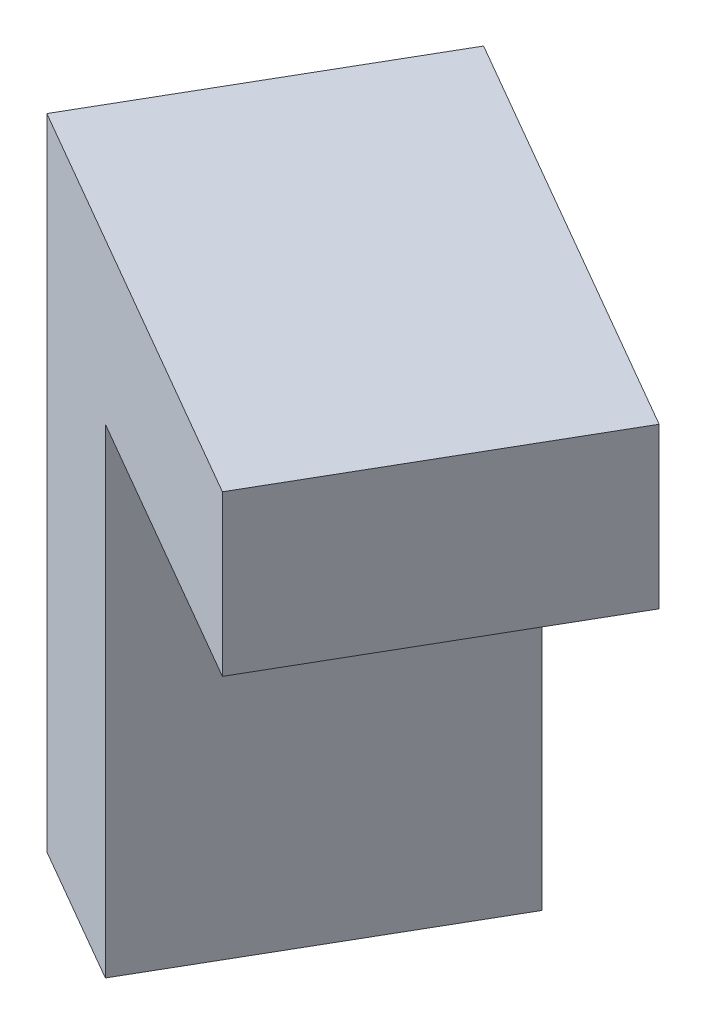
ISO-10303-21;
HEADER;
FILE_DESCRIPTION(('STEP AP214'),'2;1');
FILE_NAME('part.step','',(''),(''),'','','');
FILE_SCHEMA(('AUTOMOTIVE_DESIGN { 1 0 10303 214 1 1 1 1 }'));
ENDSEC;
DATA;
#1=APPLICATION_CONTEXT('core data for automotive mechanical design processes');
#2=APPLICATION_PROTOCOL_DEFINITION('international standard','automotive_design',2000,#1);
#3=PRODUCT_CONTEXT('',#1,'mechanical');
#4=PRODUCT('Part','Part','',(#3));
#5=PRODUCT_RELATED_PRODUCT_CATEGORY('part','',(#4));
#6=PRODUCT_DEFINITION_FORMATION('','',#4);
#7=PRODUCT_DEFINITION_CONTEXT('part definition',#1,'design');
#8=PRODUCT_DEFINITION('design','',#6,#7);
#9=PRODUCT_DEFINITION_SHAPE('','',#8);
#10=(LENGTH_UNIT() NAMED_UNIT(*) SI_UNIT(.MILLI.,.METRE.));
#11=(NAMED_UNIT(*) PLANE_ANGLE_UNIT() SI_UNIT($,.RADIAN.));
#12=(NAMED_UNIT(*) SI_UNIT($,.STERADIAN.) SOLID_ANGLE_UNIT());
#13=UNCERTAINTY_MEASURE_WITH_UNIT(LENGTH_MEASURE(1.E-05),#10,'distance_accuracy_value','');
#14=(GEOMETRIC_REPRESENTATION_CONTEXT(3) GLOBAL_UNCERTAINTY_ASSIGNED_CONTEXT((#13)) GLOBAL_UNIT_ASSIGNED_CONTEXT((#10,
#11,#12)) REPRESENTATION_CONTEXT('',''));
#15=CARTESIAN_POINT('',(0.,0.,0.));
#16=DIRECTION('',(0.,0.,1.));
#17=DIRECTION('',(1.,0.,0.));
#18=AXIS2_PLACEMENT_3D('',#15,#16,#17);
#19=CARTESIAN_POINT('',(12.3205080756888,-5.,18.6602540378444));
#20=DIRECTION('',(0.,-1.,0.));
#21=DIRECTION('',(0.,0.,-1.));
#22=AXIS2_PLACEMENT_3D('',#19,#20,#21);
#23=PLANE('',#22);
#24=DIRECTION('',(-0.866025403784439,0.,-0.5));
#25=VECTOR('',#24,1.);
#26=CARTESIAN_POINT('',(17.3205080756888,-5.,10.));
#27=LINE('',#26,#25);
#28=CARTESIAN_POINT('',(17.3205080756888,-5.,10.));
#29=VERTEX_POINT('',#28);
#30=CARTESIAN_POINT('',(4.33012701892219,-5.,2.5));
#31=VERTEX_POINT('',#30);
#32=EDGE_CURVE('E119',#29,#31,#27,.T.);
#33=ORIENTED_EDGE('',*,*,#32,.T.);
#34=DIRECTION('',(0.5,0.,-0.866025403784439));
#35=VECTOR('',#34,1.);
#36=CARTESIAN_POINT('',(-0.669872981077806,-5.,11.1602540378444));
#37=LINE('',#36,#35);
#38=CARTESIAN_POINT('',(-0.669872981077806,-5.,11.1602540378444));
#39=VERTEX_POINT('',#38);
#40=EDGE_CURVE('E11',#39,#31,#37,.T.);
#41=ORIENTED_EDGE('',*,*,#40,.F.);
#42=DIRECTION('',(-0.866025403784439,0.,-0.5));
#43=VECTOR('',#42,1.);
#44=CARTESIAN_POINT('',(12.3205080756888,-5.,18.6602540378444));
#45=LINE('',#44,#43);
#46=CARTESIAN_POINT('',(12.3205080756888,-5.,18.6602540378444));
#47=VERTEX_POINT('',#46);
#48=EDGE_CURVE('E129',#47,#39,#45,.T.);
#49=ORIENTED_EDGE('',*,*,#48,.F.);
#50=DIRECTION('',(0.5,0.,-0.866025403784439));
#51=VECTOR('',#50,1.);
#52=CARTESIAN_POINT('',(12.3205080756888,-5.,18.6602540378444));
#53=LINE('',#52,#51);
#54=EDGE_CURVE('E115',#47,#29,#53,.T.);
#55=ORIENTED_EDGE('',*,*,#54,.T.);
#56=EDGE_LOOP('',(#33,#41,#49,#55));
#57=FACE_BOUND('',#56,.T.);
#58=ADVANCED_FACE('F35',(#57),#23,.F.);
#59=CARTESIAN_POINT('',(-0.669872981077806,-5.,11.1602540378444));
#60=DIRECTION('',(0.866025403784439,0.,0.5));
#61=DIRECTION('',(0.5,0.,-0.866025403784439));
#62=AXIS2_PLACEMENT_3D('',#59,#60,#61);
#63=PLANE('',#62);
#64=DIRECTION('',(0.,-1.,0.));
#65=VECTOR('',#64,1.);
#66=CARTESIAN_POINT('',(4.33012701892219,-5.,2.5));
#67=LINE('',#66,#65);
#68=CARTESIAN_POINT('',(4.33012701892219,-25.,2.5));
#69=VERTEX_POINT('',#68);
#70=EDGE_CURVE('E122',#31,#69,#67,.T.);
#71=ORIENTED_EDGE('',*,*,#70,.T.);
#72=DIRECTION('',(0.5,0.,-0.866025403784439));
#73=VECTOR('',#72,1.);
#74=CARTESIAN_POINT('',(-0.669872981077806,-25.,11.1602540378444));
#75=LINE('',#74,#73);
#76=CARTESIAN_POINT('',(-0.669872981077806,-25.,11.1602540378444));
#77=VERTEX_POINT('',#76);
#78=EDGE_CURVE('E43',#77,#69,#75,.T.);
#79=ORIENTED_EDGE('',*,*,#78,.F.);
#80=DIRECTION('',(0.,-1.,0.));
#81=VECTOR('',#80,1.);
#82=CARTESIAN_POINT('',(-0.669872981077806,-5.,11.1602540378444));
#83=LINE('',#82,#81);
#84=EDGE_CURVE('E88',#39,#77,#83,.T.);
#85=ORIENTED_EDGE('',*,*,#84,.F.);
#86=ORIENTED_EDGE('',*,*,#40,.T.);
#87=EDGE_LOOP('',(#71,#79,#85,#86));
#88=FACE_BOUND('',#87,.T.);
#89=ADVANCED_FACE('F153',(#88),#63,.F.);
#90=CARTESIAN_POINT('',(-0.669872981077806,-25.,11.1602540378444));
#91=DIRECTION('',(0.,1.,0.));
#92=DIRECTION('',(0.,0.,1.));
#93=AXIS2_PLACEMENT_3D('',#90,#91,#92);
#94=PLANE('',#93);
#95=DIRECTION('',(0.866025403784439,0.,0.5));
#96=VECTOR('',#95,1.);
#97=CARTESIAN_POINT('',(4.33012701892219,-25.,2.5));
#98=LINE('',#97,#96);
#99=CARTESIAN_POINT('',(8.66025403784439,-25.,5.));
#100=VERTEX_POINT('',#99);
#101=EDGE_CURVE('E124',#69,#100,#98,.T.);
#102=ORIENTED_EDGE('',*,*,#101,.T.);
#103=DIRECTION('',(0.5,0.,-0.866025403784439));
#104=VECTOR('',#103,1.);
#105=CARTESIAN_POINT('',(3.66025403784439,-25.,13.6602540378444));
#106=LINE('',#105,#104);
#107=CARTESIAN_POINT('',(3.66025403784439,-25.,13.6602540378444));
#108=VERTEX_POINT('',#107);
#109=EDGE_CURVE('E110',#108,#100,#106,.T.);
#110=ORIENTED_EDGE('',*,*,#109,.F.);
#111=DIRECTION('',(0.866025403784439,0.,0.5));
#112=VECTOR('',#111,1.);
#113=CARTESIAN_POINT('',(-0.669872981077806,-25.,11.1602540378444));
#114=LINE('',#113,#112);
#115=EDGE_CURVE('E101',#77,#108,#114,.T.);
#116=ORIENTED_EDGE('',*,*,#115,.F.);
#117=ORIENTED_EDGE('',*,*,#78,.T.);
#118=EDGE_LOOP('',(#102,#110,#116,#117));
#119=FACE_BOUND('',#118,.T.);
#120=ADVANCED_FACE('F135',(#119),#94,.F.);
#121=CARTESIAN_POINT('',(3.66025403784439,-25.,13.6602540378444));
#122=DIRECTION('',(-0.866025403784439,0.,-0.5));
#123=DIRECTION('',(-0.5,0.,0.866025403784439));
#124=AXIS2_PLACEMENT_3D('',#121,#122,#123);
#125=PLANE('',#124);
#126=DIRECTION('',(0.,1.,0.));
#127=VECTOR('',#126,1.);
#128=CARTESIAN_POINT('',(8.66025403784439,-25.,5.));
#129=LINE('',#128,#127);
#130=CARTESIAN_POINT('',(8.66025403784439,-10.,5.));
#131=VERTEX_POINT('',#130);
#132=EDGE_CURVE('E109',#100,#131,#129,.T.);
#133=ORIENTED_EDGE('',*,*,#132,.T.);
#134=DIRECTION('',(0.5,0.,-0.866025403784439));
#135=VECTOR('',#134,1.);
#136=CARTESIAN_POINT('',(3.66025403784439,-10.,13.6602540378444));
#137=LINE('',#136,#135);
#138=CARTESIAN_POINT('',(3.66025403784439,-10.,13.6602540378444));
#139=VERTEX_POINT('',#138);
#140=EDGE_CURVE('E106',#139,#131,#137,.T.);
#141=ORIENTED_EDGE('',*,*,#140,.F.);
#142=DIRECTION('',(0.,1.,0.));
#143=VECTOR('',#142,1.);
#144=CARTESIAN_POINT('',(3.66025403784439,-25.,13.6602540378444));
#145=LINE('',#144,#143);
#146=EDGE_CURVE('E95',#108,#139,#145,.T.);
#147=ORIENTED_EDGE('',*,*,#146,.F.);
#148=ORIENTED_EDGE('',*,*,#109,.T.);
#149=EDGE_LOOP('',(#133,#141,#147,#148));
#150=FACE_BOUND('',#149,.T.);
#151=ADVANCED_FACE('F107',(#150),#125,.F.);
#152=CARTESIAN_POINT('',(3.66025403784439,-10.,13.6602540378444));
#153=DIRECTION('',(0.,1.,0.));
#154=DIRECTION('',(0.,0.,1.));
#155=AXIS2_PLACEMENT_3D('',#152,#153,#154);
#156=PLANE('',#155);
#157=DIRECTION('',(0.866025403784439,0.,0.5));
#158=VECTOR('',#157,1.);
#159=CARTESIAN_POINT('',(8.66025403784439,-10.,5.));
#160=LINE('',#159,#158);
#161=CARTESIAN_POINT('',(17.3205080756888,-10.,10.));
#162=VERTEX_POINT('',#161);
#163=EDGE_CURVE('E74',#131,#162,#160,.T.);
#164=ORIENTED_EDGE('',*,*,#163,.T.);
#165=DIRECTION('',(0.5,0.,-0.866025403784439));
#166=VECTOR('',#165,1.);
#167=CARTESIAN_POINT('',(12.3205080756888,-10.,18.6602540378444));
#168=LINE('',#167,#166);
#169=CARTESIAN_POINT('',(12.3205080756888,-10.,18.6602540378444));
#170=VERTEX_POINT('',#169);
#171=EDGE_CURVE('E111',#170,#162,#168,.T.);
#172=ORIENTED_EDGE('',*,*,#171,.F.);
#173=DIRECTION('',(0.866025403784439,0.,0.5));
#174=VECTOR('',#173,1.);
#175=CARTESIAN_POINT('',(3.66025403784439,-10.,13.6602540378444));
#176=LINE('',#175,#174);
#177=EDGE_CURVE('E99',#139,#170,#176,.T.);
#178=ORIENTED_EDGE('',*,*,#177,.F.);
#179=ORIENTED_EDGE('',*,*,#140,.T.);
#180=EDGE_LOOP('',(#164,#172,#178,#179));
#181=FACE_BOUND('',#180,.T.);
#182=ADVANCED_FACE('F113',(#181),#156,.F.);
#183=CARTESIAN_POINT('',(12.3205080756888,-10.,18.6602540378444));
#184=DIRECTION('',(-0.866025403784439,0.,-0.5));
#185=DIRECTION('',(-0.5,0.,0.866025403784439));
#186=AXIS2_PLACEMENT_3D('',#183,#184,#185);
#187=PLANE('',#186);
#188=DIRECTION('',(0.,1.,0.));
#189=VECTOR('',#188,1.);
#190=CARTESIAN_POINT('',(17.3205080756888,-10.,10.));
#191=LINE('',#190,#189);
#192=EDGE_CURVE('E80',#162,#29,#191,.T.);
#193=ORIENTED_EDGE('',*,*,#192,.T.);
#194=ORIENTED_EDGE('',*,*,#54,.F.);
#195=DIRECTION('',(0.,1.,0.));
#196=VECTOR('',#195,1.);
#197=CARTESIAN_POINT('',(12.3205080756888,-10.,18.6602540378444));
#198=LINE('',#197,#196);
#199=EDGE_CURVE('E51',#170,#47,#198,.T.);
#200=ORIENTED_EDGE('',*,*,#199,.F.);
#201=ORIENTED_EDGE('',*,*,#171,.T.);
#202=EDGE_LOOP('',(#193,#194,#200,#201));
#203=FACE_BOUND('',#202,.T.);
#204=ADVANCED_FACE('F142',(#203),#187,.F.);
#205=CARTESIAN_POINT('',(-5.,0.,8.66025403784439));
#206=DIRECTION('',(-0.5,0.,0.866025403784439));
#207=DIRECTION('',(0.866025403784439,0.,0.5));
#208=AXIS2_PLACEMENT_3D('',#205,#206,#207);
#209=PLANE('',#208);
#210=ORIENTED_EDGE('',*,*,#48,.T.);
#211=ORIENTED_EDGE('',*,*,#84,.T.);
#212=ORIENTED_EDGE('',*,*,#115,.T.);
#213=ORIENTED_EDGE('',*,*,#146,.T.);
#214=ORIENTED_EDGE('',*,*,#177,.T.);
#215=ORIENTED_EDGE('',*,*,#199,.T.);
#216=EDGE_LOOP('',(#210,#211,#212,#213,#214,#215));
#217=FACE_BOUND('',#216,.T.);
#218=ADVANCED_FACE('F97',(#217),#209,.T.);
#219=CARTESIAN_POINT('',(0.,0.,0.));
#220=DIRECTION('',(-0.5,0.,0.866025403784439));
#221=DIRECTION('',(0.866025403784439,0.,0.5));
#222=AXIS2_PLACEMENT_3D('',#219,#220,#221);
#223=PLANE('',#222);
#224=ORIENTED_EDGE('',*,*,#32,.F.);
#225=ORIENTED_EDGE('',*,*,#192,.F.);
#226=ORIENTED_EDGE('',*,*,#163,.F.);
#227=ORIENTED_EDGE('',*,*,#132,.F.);
#228=ORIENTED_EDGE('',*,*,#101,.F.);
#229=ORIENTED_EDGE('',*,*,#70,.F.);
#230=EDGE_LOOP('',(#224,#225,#226,#227,#228,#229));
#231=FACE_BOUND('',#230,.T.);
#232=ADVANCED_FACE('F138',(#231),#223,.F.);
#233=CLOSED_SHELL('',(#58,#89,#120,#151,#182,#204,#218,#232));
#234=MANIFOLD_SOLID_BREP('B2',#233);
#235=ADVANCED_BREP_SHAPE_REPRESENTATION('',(#18,#234),#14);
#236=SHAPE_DEFINITION_REPRESENTATION(#9,#235);
ENDSEC;
END-ISO-10303-21;
